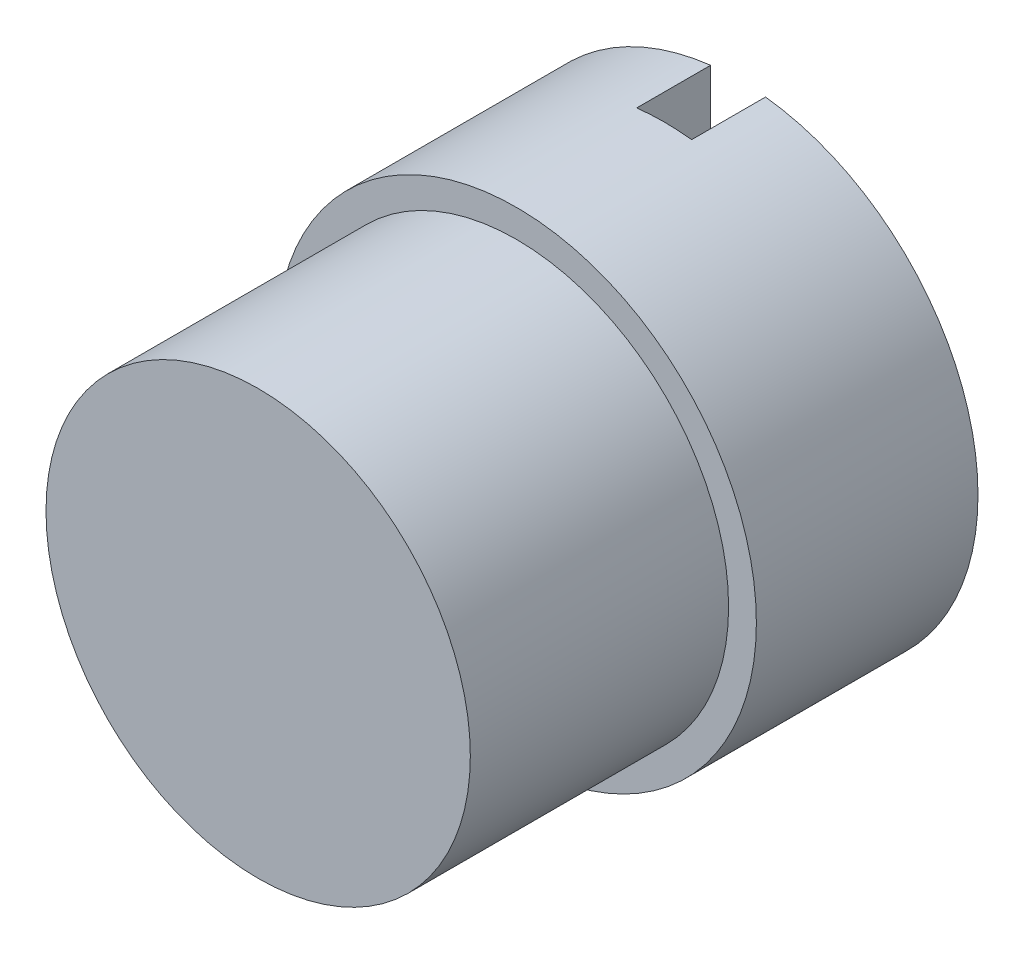
ISO-10303-21;
HEADER;
FILE_DESCRIPTION(('STEP AP214'),'2;1');
FILE_NAME('part.step','',(''),(''),'','','');
FILE_SCHEMA(('AUTOMOTIVE_DESIGN { 1 0 10303 214 1 1 1 1 }'));
ENDSEC;
DATA;
#1=APPLICATION_CONTEXT('core data for automotive mechanical design processes');
#2=APPLICATION_PROTOCOL_DEFINITION('international standard','automotive_design',2000,#1);
#3=PRODUCT_CONTEXT('',#1,'mechanical');
#4=PRODUCT('Part','Part','',(#3));
#5=PRODUCT_RELATED_PRODUCT_CATEGORY('part','',(#4));
#6=PRODUCT_DEFINITION_FORMATION('','',#4);
#7=PRODUCT_DEFINITION_CONTEXT('part definition',#1,'design');
#8=PRODUCT_DEFINITION('design','',#6,#7);
#9=PRODUCT_DEFINITION_SHAPE('','',#8);
#10=(LENGTH_UNIT() NAMED_UNIT(*) SI_UNIT(.MILLI.,.METRE.));
#11=(NAMED_UNIT(*) PLANE_ANGLE_UNIT() SI_UNIT($,.RADIAN.));
#12=(NAMED_UNIT(*) SI_UNIT($,.STERADIAN.) SOLID_ANGLE_UNIT());
#13=UNCERTAINTY_MEASURE_WITH_UNIT(LENGTH_MEASURE(1.E-05),#10,'distance_accuracy_value','');
#14=(GEOMETRIC_REPRESENTATION_CONTEXT(3) GLOBAL_UNCERTAINTY_ASSIGNED_CONTEXT((#13)) GLOBAL_UNIT_ASSIGNED_CONTEXT((#10,
#11,#12)) REPRESENTATION_CONTEXT('',''));
#15=CARTESIAN_POINT('',(0.,0.,0.));
#16=DIRECTION('',(0.,0.,1.));
#17=DIRECTION('',(1.,0.,0.));
#18=AXIS2_PLACEMENT_3D('',#15,#16,#17);
#19=CARTESIAN_POINT('',(0.,0.,-9.525));
#20=DIRECTION('',(0.,0.,1.));
#21=DIRECTION('',(1.,0.,0.));
#22=AXIS2_PLACEMENT_3D('',#19,#20,#21);
#23=PLANE('',#22);
#24=CARTESIAN_POINT('',(0.,0.,-9.525));
#25=DIRECTION('',(0.,0.,1.));
#26=DIRECTION('',(1.,0.,0.));
#27=AXIS2_PLACEMENT_3D('',#24,#25,#26);
#28=CIRCLE('',#27,10.3124);
#29=CARTESIAN_POINT('',(-1.1811,10.2445398408128,-9.525));
#30=VERTEX_POINT('',#29);
#31=CARTESIAN_POINT('',(-1.1811,-10.2445398408128,-9.525));
#32=VERTEX_POINT('',#31);
#33=EDGE_CURVE('E159',#30,#32,#28,.T.);
#34=ORIENTED_EDGE('',*,*,#33,.F.);
#35=DIRECTION('',(0.,1.,0.));
#36=VECTOR('',#35,1.);
#37=CARTESIAN_POINT('',(-1.1811,-10.3124,-9.525));
#38=LINE('',#37,#36);
#39=CARTESIAN_POINT('',(-1.1811,6.43297311046766,-9.525));
#40=VERTEX_POINT('',#39);
#41=EDGE_CURVE('E198',#40,#30,#38,.T.);
#42=ORIENTED_EDGE('',*,*,#41,.F.);
#43=CARTESIAN_POINT('',(0.,0.,-9.525));
#44=DIRECTION('',(0.,0.,1.));
#45=DIRECTION('',(1.,0.,0.));
#46=AXIS2_PLACEMENT_3D('',#43,#44,#45);
#47=CIRCLE('',#46,6.5405);
#48=CARTESIAN_POINT('',(-1.1811,-6.43297311046766,-9.525));
#49=VERTEX_POINT('',#48);
#50=EDGE_CURVE('E164',#40,#49,#47,.T.);
#51=ORIENTED_EDGE('',*,*,#50,.T.);
#52=EDGE_CURVE('E138',#32,#49,#38,.T.);
#53=ORIENTED_EDGE('',*,*,#52,.F.);
#54=EDGE_LOOP('',(#34,#42,#51,#53));
#55=FACE_BOUND('',#54,.T.);
#56=ADVANCED_FACE('F43',(#55),#23,.F.);
#57=CARTESIAN_POINT('',(0.,0.,-9.525));
#58=DIRECTION('',(0.,0.,1.));
#59=DIRECTION('',(1.,0.,0.));
#60=AXIS2_PLACEMENT_3D('',#57,#58,#59);
#61=CYLINDRICAL_SURFACE('',#60,10.3124);
#62=DIRECTION('',(0.,0.,1.));
#63=VECTOR('',#62,1.);
#64=CARTESIAN_POINT('',(1.1811,-10.2445398408128,-9.525));
#65=LINE('',#64,#63);
#66=CARTESIAN_POINT('',(1.1811,-10.2445398408128,-9.525));
#67=VERTEX_POINT('',#66);
#68=CARTESIAN_POINT('',(1.1811,-10.2445398408128,-6.35));
#69=VERTEX_POINT('',#68);
#70=EDGE_CURVE('E109',#67,#69,#65,.T.);
#71=ORIENTED_EDGE('',*,*,#70,.F.);
#72=CARTESIAN_POINT('',(1.1811,10.2445398408128,-9.525));
#73=VERTEX_POINT('',#72);
#74=EDGE_CURVE('E168',#67,#73,#28,.T.);
#75=ORIENTED_EDGE('',*,*,#74,.T.);
#76=DIRECTION('',(0.,0.,1.));
#77=VECTOR('',#76,1.);
#78=CARTESIAN_POINT('',(1.1811,10.2445398408128,-9.525));
#79=LINE('',#78,#77);
#80=CARTESIAN_POINT('',(1.1811,10.2445398408128,-6.35));
#81=VERTEX_POINT('',#80);
#82=EDGE_CURVE('E121',#81,#73,#79,.F.);
#83=ORIENTED_EDGE('',*,*,#82,.F.);
#84=CARTESIAN_POINT('',(0.,0.,-6.35));
#85=DIRECTION('',(0.,0.,1.));
#86=DIRECTION('',(1.,0.,0.));
#87=AXIS2_PLACEMENT_3D('',#84,#85,#86);
#88=CIRCLE('',#87,10.3124);
#89=CARTESIAN_POINT('',(-1.1811,10.2445398408128,-6.35));
#90=VERTEX_POINT('',#89);
#91=EDGE_CURVE('E135',#90,#81,#88,.F.);
#92=ORIENTED_EDGE('',*,*,#91,.F.);
#93=DIRECTION('',(0.,0.,1.));
#94=VECTOR('',#93,1.);
#95=CARTESIAN_POINT('',(-1.1811,10.2445398408128,-9.525));
#96=LINE('',#95,#94);
#97=EDGE_CURVE('E144',#30,#90,#96,.T.);
#98=ORIENTED_EDGE('',*,*,#97,.F.);
#99=ORIENTED_EDGE('',*,*,#33,.T.);
#100=DIRECTION('',(0.,0.,1.));
#101=VECTOR('',#100,1.);
#102=CARTESIAN_POINT('',(-1.1811,-10.2445398408128,-9.525));
#103=LINE('',#102,#101);
#104=CARTESIAN_POINT('',(-1.1811,-10.2445398408128,-6.35));
#105=VERTEX_POINT('',#104);
#106=EDGE_CURVE('E133',#105,#32,#103,.F.);
#107=ORIENTED_EDGE('',*,*,#106,.F.);
#108=EDGE_CURVE('E122',#69,#105,#88,.F.);
#109=ORIENTED_EDGE('',*,*,#108,.F.);
#110=EDGE_LOOP('',(#71,#75,#83,#92,#98,#99,#107,#109));
#111=FACE_BOUND('',#110,.T.);
#112=CARTESIAN_POINT('',(0.,0.,0.));
#113=DIRECTION('',(0.,0.,1.));
#114=DIRECTION('',(1.,0.,0.));
#115=AXIS2_PLACEMENT_3D('',#112,#113,#114);
#116=CIRCLE('',#115,10.3124);
#117=CARTESIAN_POINT('',(10.3124,0.,0.));
#118=VERTEX_POINT('',#117);
#119=EDGE_CURVE('E171',#118,#118,#116,.T.);
#120=ORIENTED_EDGE('',*,*,#119,.F.);
#121=EDGE_LOOP('',(#120));
#122=FACE_BOUND('',#121,.T.);
#123=ADVANCED_FACE('F45',(#111,#122),#61,.T.);
#124=ORIENTED_EDGE('',*,*,#74,.F.);
#125=DIRECTION('',(0.,1.,0.));
#126=VECTOR('',#125,1.);
#127=CARTESIAN_POINT('',(1.1811,-10.3124,-9.525));
#128=LINE('',#127,#126);
#129=CARTESIAN_POINT('',(1.1811,-6.43297311046766,-9.525));
#130=VERTEX_POINT('',#129);
#131=EDGE_CURVE('E115',#67,#130,#128,.T.);
#132=ORIENTED_EDGE('',*,*,#131,.T.);
#133=CARTESIAN_POINT('',(1.1811,6.43297311046766,-9.525));
#134=VERTEX_POINT('',#133);
#135=EDGE_CURVE('E160',#130,#134,#47,.T.);
#136=ORIENTED_EDGE('',*,*,#135,.T.);
#137=EDGE_CURVE('E128',#134,#73,#128,.T.);
#138=ORIENTED_EDGE('',*,*,#137,.T.);
#139=EDGE_LOOP('',(#124,#132,#136,#138));
#140=FACE_BOUND('',#139,.T.);
#141=ADVANCED_FACE('F221',(#140),#23,.F.);
#142=CARTESIAN_POINT('',(0.,0.,0.));
#143=DIRECTION('',(0.,0.,1.));
#144=DIRECTION('',(1.,0.,0.));
#145=AXIS2_PLACEMENT_3D('',#142,#143,#144);
#146=PLANE('',#145);
#147=CARTESIAN_POINT('',(0.,0.,0.));
#148=DIRECTION('',(0.,0.,1.));
#149=DIRECTION('',(1.,0.,0.));
#150=AXIS2_PLACEMENT_3D('',#147,#148,#149);
#151=CIRCLE('',#150,9.1186);
#152=CARTESIAN_POINT('',(9.1186,0.,0.));
#153=VERTEX_POINT('',#152);
#154=EDGE_CURVE('E154',#153,#153,#151,.T.);
#155=ORIENTED_EDGE('',*,*,#154,.F.);
#156=EDGE_LOOP('',(#155));
#157=FACE_BOUND('',#156,.T.);
#158=ORIENTED_EDGE('',*,*,#119,.T.);
#159=EDGE_LOOP('',(#158));
#160=FACE_BOUND('',#159,.T.);
#161=ADVANCED_FACE('F241',(#157,#160),#146,.T.);
#162=CARTESIAN_POINT('',(0.,0.,-9.525));
#163=DIRECTION('',(0.,0.,1.));
#164=DIRECTION('',(1.,0.,0.));
#165=AXIS2_PLACEMENT_3D('',#162,#163,#164);
#166=CYLINDRICAL_SURFACE('',#165,6.5405);
#167=CARTESIAN_POINT('',(0.,0.,-6.35));
#168=DIRECTION('',(0.,0.,1.));
#169=DIRECTION('',(1.,0.,0.));
#170=AXIS2_PLACEMENT_3D('',#167,#168,#169);
#171=CIRCLE('',#170,6.5405);
#172=CARTESIAN_POINT('',(1.1811,-6.43297311046766,-6.35));
#173=VERTEX_POINT('',#172);
#174=CARTESIAN_POINT('',(-1.1811,-6.43297311046766,-6.35));
#175=VERTEX_POINT('',#174);
#176=EDGE_CURVE('E126',#173,#175,#171,.F.);
#177=ORIENTED_EDGE('',*,*,#176,.T.);
#178=DIRECTION('',(0.,0.,1.));
#179=VECTOR('',#178,1.);
#180=CARTESIAN_POINT('',(-1.1811,-6.43297311046766,-9.525));
#181=LINE('',#180,#179);
#182=EDGE_CURVE('E11',#175,#49,#181,.F.);
#183=ORIENTED_EDGE('',*,*,#182,.T.);
#184=ORIENTED_EDGE('',*,*,#50,.F.);
#185=DIRECTION('',(0.,0.,1.));
#186=VECTOR('',#185,1.);
#187=CARTESIAN_POINT('',(-1.1811,6.43297311046766,-9.525));
#188=LINE('',#187,#186);
#189=CARTESIAN_POINT('',(-1.1811,6.43297311046766,-6.35));
#190=VERTEX_POINT('',#189);
#191=EDGE_CURVE('E182',#40,#190,#188,.T.);
#192=ORIENTED_EDGE('',*,*,#191,.T.);
#193=CARTESIAN_POINT('',(1.1811,6.43297311046766,-6.35));
#194=VERTEX_POINT('',#193);
#195=EDGE_CURVE('E158',#190,#194,#171,.F.);
#196=ORIENTED_EDGE('',*,*,#195,.T.);
#197=DIRECTION('',(0.,0.,1.));
#198=VECTOR('',#197,1.);
#199=CARTESIAN_POINT('',(1.1811,6.43297311046766,-9.525));
#200=LINE('',#199,#198);
#201=EDGE_CURVE('E178',#194,#134,#200,.F.);
#202=ORIENTED_EDGE('',*,*,#201,.T.);
#203=ORIENTED_EDGE('',*,*,#135,.F.);
#204=DIRECTION('',(0.,0.,1.));
#205=VECTOR('',#204,1.);
#206=CARTESIAN_POINT('',(1.1811,-6.43297311046766,-9.525));
#207=LINE('',#206,#205);
#208=EDGE_CURVE('E52',#130,#173,#207,.T.);
#209=ORIENTED_EDGE('',*,*,#208,.T.);
#210=EDGE_LOOP('',(#177,#183,#184,#192,#196,#202,#203,#209));
#211=FACE_BOUND('',#210,.T.);
#212=CARTESIAN_POINT('',(0.,0.,0.));
#213=DIRECTION('',(0.,0.,1.));
#214=DIRECTION('',(1.,0.,0.));
#215=AXIS2_PLACEMENT_3D('',#212,#213,#214);
#216=CIRCLE('',#215,6.5405);
#217=CARTESIAN_POINT('',(6.5405,0.,0.));
#218=VERTEX_POINT('',#217);
#219=EDGE_CURVE('E153',#218,#218,#216,.T.);
#220=ORIENTED_EDGE('',*,*,#219,.T.);
#221=EDGE_LOOP('',(#220));
#222=FACE_BOUND('',#221,.T.);
#223=ADVANCED_FACE('F189',(#211,#222),#166,.F.);
#224=CARTESIAN_POINT('',(0.,0.,11.0998));
#225=DIRECTION('',(0.,0.,1.));
#226=DIRECTION('',(1.,0.,0.));
#227=AXIS2_PLACEMENT_3D('',#224,#225,#226);
#228=PLANE('',#227);
#229=CARTESIAN_POINT('',(0.,0.,11.0998));
#230=DIRECTION('',(0.,0.,1.));
#231=DIRECTION('',(1.,0.,0.));
#232=AXIS2_PLACEMENT_3D('',#229,#230,#231);
#233=CIRCLE('',#232,9.1186);
#234=CARTESIAN_POINT('',(9.1186,0.,11.0998));
#235=VERTEX_POINT('',#234);
#236=EDGE_CURVE('E149',#235,#235,#233,.T.);
#237=ORIENTED_EDGE('',*,*,#236,.T.);
#238=EDGE_LOOP('',(#237));
#239=FACE_BOUND('',#238,.T.);
#240=ADVANCED_FACE('F249',(#239),#228,.T.);
#241=CARTESIAN_POINT('',(0.,0.,11.0998));
#242=DIRECTION('',(0.,0.,-1.));
#243=DIRECTION('',(-1.,0.,0.));
#244=AXIS2_PLACEMENT_3D('',#241,#242,#243);
#245=CYLINDRICAL_SURFACE('',#244,9.1186);
#246=ORIENTED_EDGE('',*,*,#236,.F.);
#247=EDGE_LOOP('',(#246));
#248=FACE_BOUND('',#247,.T.);
#249=ORIENTED_EDGE('',*,*,#154,.T.);
#250=EDGE_LOOP('',(#249));
#251=FACE_BOUND('',#250,.T.);
#252=ADVANCED_FACE('F254',(#248,#251),#245,.T.);
#253=CARTESIAN_POINT('',(0.,0.,0.));
#254=DIRECTION('',(0.,0.,1.));
#255=DIRECTION('',(1.,0.,0.));
#256=AXIS2_PLACEMENT_3D('',#253,#254,#255);
#257=PLANE('',#256);
#258=ORIENTED_EDGE('',*,*,#219,.F.);
#259=EDGE_LOOP('',(#258));
#260=FACE_BOUND('',#259,.T.);
#261=ADVANCED_FACE('F231',(#260),#257,.F.);
#262=CARTESIAN_POINT('',(-1.1811,-10.3124,-6.35));
#263=DIRECTION('',(0.,0.,1.));
#264=DIRECTION('',(1.,0.,0.));
#265=AXIS2_PLACEMENT_3D('',#262,#263,#264);
#266=PLANE('',#265);
#267=ORIENTED_EDGE('',*,*,#91,.T.);
#268=DIRECTION('',(0.,1.,0.));
#269=VECTOR('',#268,1.);
#270=CARTESIAN_POINT('',(1.1811,-10.3124,-6.35));
#271=LINE('',#270,#269);
#272=EDGE_CURVE('E67',#194,#81,#271,.T.);
#273=ORIENTED_EDGE('',*,*,#272,.F.);
#274=ORIENTED_EDGE('',*,*,#195,.F.);
#275=DIRECTION('',(0.,1.,0.));
#276=VECTOR('',#275,1.);
#277=CARTESIAN_POINT('',(-1.1811,-10.3124,-6.35));
#278=LINE('',#277,#276);
#279=EDGE_CURVE('E140',#190,#90,#278,.T.);
#280=ORIENTED_EDGE('',*,*,#279,.T.);
#281=EDGE_LOOP('',(#267,#273,#274,#280));
#282=FACE_BOUND('',#281,.T.);
#283=ADVANCED_FACE('F208',(#282),#266,.F.);
#284=CARTESIAN_POINT('',(1.1811,-10.3124,-9.525));
#285=DIRECTION('',(1.,0.,0.));
#286=DIRECTION('',(0.,0.,-1.));
#287=AXIS2_PLACEMENT_3D('',#284,#285,#286);
#288=PLANE('',#287);
#289=ORIENTED_EDGE('',*,*,#82,.T.);
#290=ORIENTED_EDGE('',*,*,#137,.F.);
#291=ORIENTED_EDGE('',*,*,#201,.F.);
#292=ORIENTED_EDGE('',*,*,#272,.T.);
#293=EDGE_LOOP('',(#289,#290,#291,#292));
#294=FACE_BOUND('',#293,.T.);
#295=ADVANCED_FACE('F222',(#294),#288,.F.);
#296=CARTESIAN_POINT('',(-1.1811,-10.3124,-9.525));
#297=DIRECTION('',(-1.,0.,0.));
#298=DIRECTION('',(0.,0.,1.));
#299=AXIS2_PLACEMENT_3D('',#296,#297,#298);
#300=PLANE('',#299);
#301=ORIENTED_EDGE('',*,*,#97,.T.);
#302=ORIENTED_EDGE('',*,*,#279,.F.);
#303=ORIENTED_EDGE('',*,*,#191,.F.);
#304=ORIENTED_EDGE('',*,*,#41,.T.);
#305=EDGE_LOOP('',(#301,#302,#303,#304));
#306=FACE_BOUND('',#305,.T.);
#307=ADVANCED_FACE('F207',(#306),#300,.F.);
#308=ORIENTED_EDGE('',*,*,#106,.T.);
#309=ORIENTED_EDGE('',*,*,#52,.T.);
#310=ORIENTED_EDGE('',*,*,#182,.F.);
#311=EDGE_CURVE('E59',#105,#175,#278,.T.);
#312=ORIENTED_EDGE('',*,*,#311,.F.);
#313=EDGE_LOOP('',(#308,#309,#310,#312));
#314=FACE_BOUND('',#313,.T.);
#315=ADVANCED_FACE('F229',(#314),#300,.F.);
#316=ORIENTED_EDGE('',*,*,#70,.T.);
#317=EDGE_CURVE('E112',#69,#173,#271,.T.);
#318=ORIENTED_EDGE('',*,*,#317,.T.);
#319=ORIENTED_EDGE('',*,*,#208,.F.);
#320=ORIENTED_EDGE('',*,*,#131,.F.);
#321=EDGE_LOOP('',(#316,#318,#319,#320));
#322=FACE_BOUND('',#321,.T.);
#323=ADVANCED_FACE('F111',(#322),#288,.F.);
#324=ORIENTED_EDGE('',*,*,#108,.T.);
#325=ORIENTED_EDGE('',*,*,#311,.T.);
#326=ORIENTED_EDGE('',*,*,#176,.F.);
#327=ORIENTED_EDGE('',*,*,#317,.F.);
#328=EDGE_LOOP('',(#324,#325,#326,#327));
#329=FACE_BOUND('',#328,.T.);
#330=ADVANCED_FACE('F124',(#329),#266,.F.);
#331=CLOSED_SHELL('',(#56,#123,#141,#161,#223,#240,#252,#261,#283,#295,#307,#315,#323,#330));
#332=MANIFOLD_SOLID_BREP('B2',#331);
#333=ADVANCED_BREP_SHAPE_REPRESENTATION('',(#18,#332),#14);
#334=SHAPE_DEFINITION_REPRESENTATION(#9,#333);
ENDSEC;
END-ISO-10303-21;
